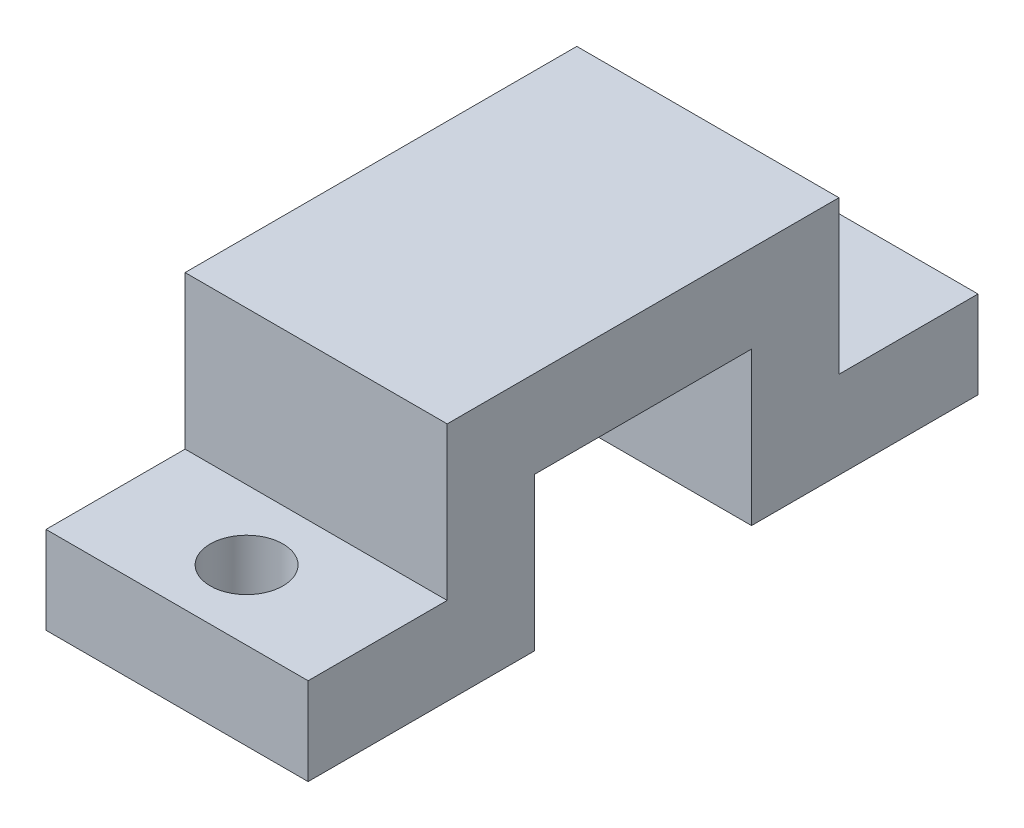
ISO-10303-21;
HEADER;
FILE_DESCRIPTION(('STEP AP214'),'2;1');
FILE_NAME('part.step','',(''),(''),'','','');
FILE_SCHEMA(('AUTOMOTIVE_DESIGN { 1 0 10303 214 1 1 1 1 }'));
ENDSEC;
DATA;
#1=APPLICATION_CONTEXT('core data for automotive mechanical design processes');
#2=APPLICATION_PROTOCOL_DEFINITION('international standard','automotive_design',2000,#1);
#3=PRODUCT_CONTEXT('',#1,'mechanical');
#4=PRODUCT('Part','Part','',(#3));
#5=PRODUCT_RELATED_PRODUCT_CATEGORY('part','',(#4));
#6=PRODUCT_DEFINITION_FORMATION('','',#4);
#7=PRODUCT_DEFINITION_CONTEXT('part definition',#1,'design');
#8=PRODUCT_DEFINITION('design','',#6,#7);
#9=PRODUCT_DEFINITION_SHAPE('','',#8);
#10=(LENGTH_UNIT() NAMED_UNIT(*) SI_UNIT(.MILLI.,.METRE.));
#11=(NAMED_UNIT(*) PLANE_ANGLE_UNIT() SI_UNIT($,.RADIAN.));
#12=(NAMED_UNIT(*) SI_UNIT($,.STERADIAN.) SOLID_ANGLE_UNIT());
#13=UNCERTAINTY_MEASURE_WITH_UNIT(LENGTH_MEASURE(1.E-05),#10,'distance_accuracy_value','');
#14=(GEOMETRIC_REPRESENTATION_CONTEXT(3) GLOBAL_UNCERTAINTY_ASSIGNED_CONTEXT((#13)) GLOBAL_UNIT_ASSIGNED_CONTEXT((#10,
#11,#12)) REPRESENTATION_CONTEXT('',''));
#15=CARTESIAN_POINT('',(0.,0.,0.));
#16=DIRECTION('',(0.,0.,1.));
#17=DIRECTION('',(1.,0.,0.));
#18=AXIS2_PLACEMENT_3D('',#15,#16,#17);
#19=CARTESIAN_POINT('',(0.,0.,0.));
#20=DIRECTION('',(0.,-1.,0.));
#21=DIRECTION('',(0.,0.,-1.));
#22=AXIS2_PLACEMENT_3D('',#19,#20,#21);
#23=PLANE('',#22);
#24=CARTESIAN_POINT('',(4.5,0.,-20.8336828319911));
#25=DIRECTION('',(0.,-1.,0.));
#26=DIRECTION('',(0.,0.,-1.));
#27=AXIS2_PLACEMENT_3D('',#24,#25,#26);
#28=CIRCLE('',#27,1.24999999999999);
#29=CARTESIAN_POINT('',(4.5,0.,-22.0836828319911));
#30=VERTEX_POINT('',#29);
#31=EDGE_CURVE('E266',#30,#30,#28,.T.);
#32=ORIENTED_EDGE('',*,*,#31,.F.);
#33=EDGE_LOOP('',(#32));
#34=FACE_BOUND('',#33,.T.);
#35=DIRECTION('',(0.,0.,-1.));
#36=VECTOR('',#35,1.);
#37=CARTESIAN_POINT('',(9.,0.,-0.2211828319911));
#38=LINE('',#37,#36);
#39=CARTESIAN_POINT('',(9.,0.,-15.4461828319911));
#40=VERTEX_POINT('',#39);
#41=CARTESIAN_POINT('',(9.,0.,-23.2211828319911));
#42=VERTEX_POINT('',#41);
#43=EDGE_CURVE('E234',#40,#42,#38,.T.);
#44=ORIENTED_EDGE('',*,*,#43,.F.);
#45=DIRECTION('',(-1.,0.,0.));
#46=VECTOR('',#45,1.);
#47=CARTESIAN_POINT('',(0.,0.,-15.4461828319911));
#48=LINE('',#47,#46);
#49=CARTESIAN_POINT('',(0.,0.,-15.4461828319911));
#50=VERTEX_POINT('',#49);
#51=EDGE_CURVE('E77',#40,#50,#48,.T.);
#52=ORIENTED_EDGE('',*,*,#51,.T.);
#53=DIRECTION('',(0.,0.,1.));
#54=VECTOR('',#53,1.);
#55=CARTESIAN_POINT('',(0.,0.,-0.2211828319911));
#56=LINE('',#55,#54);
#57=CARTESIAN_POINT('',(0.,0.,-23.2211828319911));
#58=VERTEX_POINT('',#57);
#59=EDGE_CURVE('E228',#58,#50,#56,.T.);
#60=ORIENTED_EDGE('',*,*,#59,.F.);
#61=DIRECTION('',(-1.,0.,0.));
#62=VECTOR('',#61,1.);
#63=CARTESIAN_POINT('',(0.,0.,-23.2211828319911));
#64=LINE('',#63,#62);
#65=EDGE_CURVE('E236',#42,#58,#64,.T.);
#66=ORIENTED_EDGE('',*,*,#65,.F.);
#67=EDGE_LOOP('',(#44,#52,#60,#66));
#68=FACE_BOUND('',#67,.T.);
#69=ADVANCED_FACE('F69',(#34,#68),#23,.T.);
#70=CARTESIAN_POINT('',(0.,15.,-0.2211828319911));
#71=DIRECTION('',(1.,0.,0.));
#72=DIRECTION('',(0.,0.,-1.));
#73=AXIS2_PLACEMENT_3D('',#70,#71,#72);
#74=PLANE('',#73);
#75=DIRECTION('',(0.,0.,-1.));
#76=VECTOR('',#75,1.);
#77=CARTESIAN_POINT('',(0.,5.25,-0.2211828319911));
#78=LINE('',#77,#76);
#79=CARTESIAN_POINT('',(0.,5.25,-7.99618283199105));
#80=VERTEX_POINT('',#79);
#81=CARTESIAN_POINT('',(0.,5.25,-15.4461828319911));
#82=VERTEX_POINT('',#81);
#83=EDGE_CURVE('E187',#80,#82,#78,.T.);
#84=ORIENTED_EDGE('',*,*,#83,.F.);
#85=DIRECTION('',(0.,-1.,0.));
#86=VECTOR('',#85,1.);
#87=CARTESIAN_POINT('',(0.,15.,-7.99618283199105));
#88=LINE('',#87,#86);
#89=CARTESIAN_POINT('',(0.,0.,-7.99618283199105));
#90=VERTEX_POINT('',#89);
#91=EDGE_CURVE('E164',#80,#90,#88,.T.);
#92=ORIENTED_EDGE('',*,*,#91,.T.);
#93=CARTESIAN_POINT('',(0.,0.,-0.2211828319911));
#94=VERTEX_POINT('',#93);
#95=EDGE_CURVE('E227',#90,#94,#56,.T.);
#96=ORIENTED_EDGE('',*,*,#95,.T.);
#97=DIRECTION('',(0.,-1.,0.));
#98=VECTOR('',#97,1.);
#99=CARTESIAN_POINT('',(0.,15.,-0.2211828319911));
#100=LINE('',#99,#98);
#101=CARTESIAN_POINT('',(0.,3.,-0.2211828319911));
#102=VERTEX_POINT('',#101);
#103=EDGE_CURVE('E246',#102,#94,#100,.T.);
#104=ORIENTED_EDGE('',*,*,#103,.F.);
#105=DIRECTION('',(0.,0.,-1.));
#106=VECTOR('',#105,1.);
#107=CARTESIAN_POINT('',(0.,3.,-0.2211828319911));
#108=LINE('',#107,#106);
#109=CARTESIAN_POINT('',(0.,3.,-4.99618283199106));
#110=VERTEX_POINT('',#109);
#111=EDGE_CURVE('E216',#102,#110,#108,.T.);
#112=ORIENTED_EDGE('',*,*,#111,.T.);
#113=DIRECTION('',(0.,1.,0.));
#114=VECTOR('',#113,1.);
#115=CARTESIAN_POINT('',(0.,15.,-4.99618283199106));
#116=LINE('',#115,#114);
#117=CARTESIAN_POINT('',(0.,8.25,-4.99618283199106));
#118=VERTEX_POINT('',#117);
#119=EDGE_CURVE('E219',#110,#118,#116,.T.);
#120=ORIENTED_EDGE('',*,*,#119,.T.);
#121=DIRECTION('',(0.,0.,-1.));
#122=VECTOR('',#121,1.);
#123=CARTESIAN_POINT('',(0.,8.25,-0.2211828319911));
#124=LINE('',#123,#122);
#125=CARTESIAN_POINT('',(0.,8.25,-18.4461828319911));
#126=VERTEX_POINT('',#125);
#127=EDGE_CURVE('E222',#118,#126,#124,.T.);
#128=ORIENTED_EDGE('',*,*,#127,.T.);
#129=DIRECTION('',(0.,1.,0.));
#130=VECTOR('',#129,1.);
#131=CARTESIAN_POINT('',(0.,15.,-18.4461828319911));
#132=LINE('',#131,#130);
#133=CARTESIAN_POINT('',(0.,3.,-18.4461828319911));
#134=VERTEX_POINT('',#133);
#135=EDGE_CURVE('E225',#134,#126,#132,.T.);
#136=ORIENTED_EDGE('',*,*,#135,.F.);
#137=DIRECTION('',(0.,0.,-1.));
#138=VECTOR('',#137,1.);
#139=CARTESIAN_POINT('',(0.,3.,-0.2211828319911));
#140=LINE('',#139,#138);
#141=CARTESIAN_POINT('',(0.,3.,-23.2211828319911));
#142=VERTEX_POINT('',#141);
#143=EDGE_CURVE('E203',#134,#142,#140,.T.);
#144=ORIENTED_EDGE('',*,*,#143,.T.);
#145=DIRECTION('',(0.,-1.,0.));
#146=VECTOR('',#145,1.);
#147=CARTESIAN_POINT('',(0.,15.,-23.2211828319911));
#148=LINE('',#147,#146);
#149=EDGE_CURVE('E239',#142,#58,#148,.T.);
#150=ORIENTED_EDGE('',*,*,#149,.T.);
#151=ORIENTED_EDGE('',*,*,#59,.T.);
#152=DIRECTION('',(0.,-1.,0.));
#153=VECTOR('',#152,1.);
#154=CARTESIAN_POINT('',(0.,15.,-15.4461828319911));
#155=LINE('',#154,#153);
#156=EDGE_CURVE('E84',#82,#50,#155,.T.);
#157=ORIENTED_EDGE('',*,*,#156,.F.);
#158=EDGE_LOOP('',(#84,#92,#96,#104,#112,#120,#128,#136,#144,#150,#151,#157));
#159=FACE_BOUND('',#158,.T.);
#160=ADVANCED_FACE('F71',(#159),#74,.F.);
#161=CARTESIAN_POINT('',(0.,15.,-0.2211828319911));
#162=DIRECTION('',(0.,0.,-1.));
#163=DIRECTION('',(-1.,0.,0.));
#164=AXIS2_PLACEMENT_3D('',#161,#162,#163);
#165=PLANE('',#164);
#166=DIRECTION('',(0.,-1.,0.));
#167=VECTOR('',#166,1.);
#168=CARTESIAN_POINT('',(9.,15.,-0.2211828319911));
#169=LINE('',#168,#167);
#170=CARTESIAN_POINT('',(9.,3.,-0.2211828319911));
#171=VERTEX_POINT('',#170);
#172=CARTESIAN_POINT('',(9.,0.,-0.2211828319911));
#173=VERTEX_POINT('',#172);
#174=EDGE_CURVE('E244',#171,#173,#169,.T.);
#175=ORIENTED_EDGE('',*,*,#174,.F.);
#176=DIRECTION('',(1.,0.,0.));
#177=VECTOR('',#176,1.);
#178=CARTESIAN_POINT('',(-6.,3.,-0.2211828319911));
#179=LINE('',#178,#177);
#180=EDGE_CURVE('E212',#102,#171,#179,.T.);
#181=ORIENTED_EDGE('',*,*,#180,.F.);
#182=ORIENTED_EDGE('',*,*,#103,.T.);
#183=DIRECTION('',(1.,0.,0.));
#184=VECTOR('',#183,1.);
#185=CARTESIAN_POINT('',(0.,0.,-0.2211828319911));
#186=LINE('',#185,#184);
#187=EDGE_CURVE('E231',#94,#173,#186,.T.);
#188=ORIENTED_EDGE('',*,*,#187,.T.);
#189=EDGE_LOOP('',(#175,#181,#182,#188));
#190=FACE_BOUND('',#189,.T.);
#191=ADVANCED_FACE('F297',(#190),#165,.F.);
#192=CARTESIAN_POINT('',(9.,15.,-0.2211828319911));
#193=DIRECTION('',(-1.,0.,0.));
#194=DIRECTION('',(0.,0.,1.));
#195=AXIS2_PLACEMENT_3D('',#192,#193,#194);
#196=PLANE('',#195);
#197=CARTESIAN_POINT('',(9.,0.,-7.99618283199105));
#198=VERTEX_POINT('',#197);
#199=EDGE_CURVE('E181',#173,#198,#38,.T.);
#200=ORIENTED_EDGE('',*,*,#199,.T.);
#201=DIRECTION('',(0.,-1.,0.));
#202=VECTOR('',#201,1.);
#203=CARTESIAN_POINT('',(9.,5.25,-7.99618283199105));
#204=LINE('',#203,#202);
#205=CARTESIAN_POINT('',(9.,5.25,-7.99618283199105));
#206=VERTEX_POINT('',#205);
#207=EDGE_CURVE('E161',#206,#198,#204,.T.);
#208=ORIENTED_EDGE('',*,*,#207,.F.);
#209=DIRECTION('',(0.,0.,-1.));
#210=VECTOR('',#209,1.);
#211=CARTESIAN_POINT('',(9.,5.25,-7.99618283199105));
#212=LINE('',#211,#210);
#213=CARTESIAN_POINT('',(9.,5.25,-15.4461828319911));
#214=VERTEX_POINT('',#213);
#215=EDGE_CURVE('E171',#206,#214,#212,.T.);
#216=ORIENTED_EDGE('',*,*,#215,.T.);
#217=DIRECTION('',(0.,-1.,0.));
#218=VECTOR('',#217,1.);
#219=CARTESIAN_POINT('',(9.,5.25,-15.4461828319911));
#220=LINE('',#219,#218);
#221=EDGE_CURVE('E176',#214,#40,#220,.T.);
#222=ORIENTED_EDGE('',*,*,#221,.T.);
#223=ORIENTED_EDGE('',*,*,#43,.T.);
#224=DIRECTION('',(0.,-1.,0.));
#225=VECTOR('',#224,1.);
#226=CARTESIAN_POINT('',(9.,15.,-23.2211828319911));
#227=LINE('',#226,#225);
#228=CARTESIAN_POINT('',(9.,3.,-23.2211828319911));
#229=VERTEX_POINT('',#228);
#230=EDGE_CURVE('E241',#229,#42,#227,.T.);
#231=ORIENTED_EDGE('',*,*,#230,.F.);
#232=DIRECTION('',(0.,0.,-1.));
#233=VECTOR('',#232,1.);
#234=CARTESIAN_POINT('',(9.,3.,0.));
#235=LINE('',#234,#233);
#236=CARTESIAN_POINT('',(9.,3.,-18.4461828319911));
#237=VERTEX_POINT('',#236);
#238=EDGE_CURVE('E92',#237,#229,#235,.T.);
#239=ORIENTED_EDGE('',*,*,#238,.F.);
#240=DIRECTION('',(0.,1.,0.));
#241=VECTOR('',#240,1.);
#242=CARTESIAN_POINT('',(9.,0.,-18.4461828319911));
#243=LINE('',#242,#241);
#244=CARTESIAN_POINT('',(9.,8.25,-18.4461828319911));
#245=VERTEX_POINT('',#244);
#246=EDGE_CURVE('E198',#237,#245,#243,.T.);
#247=ORIENTED_EDGE('',*,*,#246,.T.);
#248=DIRECTION('',(0.,0.,-1.));
#249=VECTOR('',#248,1.);
#250=CARTESIAN_POINT('',(9.,8.25,0.));
#251=LINE('',#250,#249);
#252=CARTESIAN_POINT('',(9.,8.25,-4.99618283199106));
#253=VERTEX_POINT('',#252);
#254=EDGE_CURVE('E195',#253,#245,#251,.T.);
#255=ORIENTED_EDGE('',*,*,#254,.F.);
#256=DIRECTION('',(0.,1.,0.));
#257=VECTOR('',#256,1.);
#258=CARTESIAN_POINT('',(9.,0.,-4.99618283199106));
#259=LINE('',#258,#257);
#260=CARTESIAN_POINT('',(9.,3.,-4.99618283199106));
#261=VERTEX_POINT('',#260);
#262=EDGE_CURVE('E192',#261,#253,#259,.T.);
#263=ORIENTED_EDGE('',*,*,#262,.F.);
#264=EDGE_CURVE('E189',#171,#261,#235,.T.);
#265=ORIENTED_EDGE('',*,*,#264,.F.);
#266=ORIENTED_EDGE('',*,*,#174,.T.);
#267=EDGE_LOOP('',(#200,#208,#216,#222,#223,#231,#239,#247,#255,#263,#265,#266));
#268=FACE_BOUND('',#267,.T.);
#269=ADVANCED_FACE('F179',(#268),#196,.F.);
#270=CARTESIAN_POINT('',(0.,15.,-23.2211828319911));
#271=DIRECTION('',(0.,0.,1.));
#272=DIRECTION('',(1.,0.,0.));
#273=AXIS2_PLACEMENT_3D('',#270,#271,#272);
#274=PLANE('',#273);
#275=ORIENTED_EDGE('',*,*,#149,.F.);
#276=DIRECTION('',(1.,0.,0.));
#277=VECTOR('',#276,1.);
#278=CARTESIAN_POINT('',(-6.,3.,-23.2211828319911));
#279=LINE('',#278,#277);
#280=EDGE_CURVE('E201',#142,#229,#279,.T.);
#281=ORIENTED_EDGE('',*,*,#280,.T.);
#282=ORIENTED_EDGE('',*,*,#230,.T.);
#283=ORIENTED_EDGE('',*,*,#65,.T.);
#284=EDGE_LOOP('',(#275,#281,#282,#283));
#285=FACE_BOUND('',#284,.T.);
#286=ADVANCED_FACE('F256',(#285),#274,.F.);
#287=CARTESIAN_POINT('',(4.5,0.,-2.60868283199106));
#288=DIRECTION('',(0.,-1.,0.));
#289=DIRECTION('',(0.,0.,-1.));
#290=AXIS2_PLACEMENT_3D('',#287,#288,#289);
#291=CIRCLE('',#290,1.24999999999999);
#292=CARTESIAN_POINT('',(4.5,0.,-3.85868283199105));
#293=VERTEX_POINT('',#292);
#294=EDGE_CURVE('E168',#293,#293,#291,.T.);
#295=ORIENTED_EDGE('',*,*,#294,.F.);
#296=EDGE_LOOP('',(#295));
#297=FACE_BOUND('',#296,.T.);
#298=DIRECTION('',(-1.,0.,0.));
#299=VECTOR('',#298,1.);
#300=CARTESIAN_POINT('',(0.,0.,-7.99618283199105));
#301=LINE('',#300,#299);
#302=EDGE_CURVE('E12',#198,#90,#301,.T.);
#303=ORIENTED_EDGE('',*,*,#302,.F.);
#304=ORIENTED_EDGE('',*,*,#199,.F.);
#305=ORIENTED_EDGE('',*,*,#187,.F.);
#306=ORIENTED_EDGE('',*,*,#95,.F.);
#307=EDGE_LOOP('',(#303,#304,#305,#306));
#308=FACE_BOUND('',#307,.T.);
#309=ADVANCED_FACE('F302',(#297,#308),#23,.T.);
#310=CARTESIAN_POINT('',(-6.,0.,-18.4461828319911));
#311=DIRECTION('',(0.,0.,-1.));
#312=DIRECTION('',(-1.,0.,0.));
#313=AXIS2_PLACEMENT_3D('',#310,#311,#312);
#314=PLANE('',#313);
#315=ORIENTED_EDGE('',*,*,#135,.T.);
#316=DIRECTION('',(1.,0.,0.));
#317=VECTOR('',#316,1.);
#318=CARTESIAN_POINT('',(-6.,8.25,-18.4461828319911));
#319=LINE('',#318,#317);
#320=EDGE_CURVE('E206',#126,#245,#319,.T.);
#321=ORIENTED_EDGE('',*,*,#320,.T.);
#322=ORIENTED_EDGE('',*,*,#246,.F.);
#323=DIRECTION('',(1.,0.,0.));
#324=VECTOR('',#323,1.);
#325=CARTESIAN_POINT('',(-6.,3.,-18.4461828319911));
#326=LINE('',#325,#324);
#327=EDGE_CURVE('E204',#134,#237,#326,.T.);
#328=ORIENTED_EDGE('',*,*,#327,.F.);
#329=EDGE_LOOP('',(#315,#321,#322,#328));
#330=FACE_BOUND('',#329,.T.);
#331=ADVANCED_FACE('F282',(#330),#314,.T.);
#332=CARTESIAN_POINT('',(-6.,8.25,0.));
#333=DIRECTION('',(0.,-1.,0.));
#334=DIRECTION('',(0.,0.,-1.));
#335=AXIS2_PLACEMENT_3D('',#332,#333,#334);
#336=PLANE('',#335);
#337=DIRECTION('',(1.,0.,0.));
#338=VECTOR('',#337,1.);
#339=CARTESIAN_POINT('',(-6.,8.25,-4.99618283199106));
#340=LINE('',#339,#338);
#341=EDGE_CURVE('E208',#118,#253,#340,.T.);
#342=ORIENTED_EDGE('',*,*,#341,.T.);
#343=ORIENTED_EDGE('',*,*,#254,.T.);
#344=ORIENTED_EDGE('',*,*,#320,.F.);
#345=ORIENTED_EDGE('',*,*,#127,.F.);
#346=EDGE_LOOP('',(#342,#343,#344,#345));
#347=FACE_BOUND('',#346,.T.);
#348=ADVANCED_FACE('F288',(#347),#336,.F.);
#349=CARTESIAN_POINT('',(-6.,0.,-4.99618283199106));
#350=DIRECTION('',(0.,0.,-1.));
#351=DIRECTION('',(-1.,0.,0.));
#352=AXIS2_PLACEMENT_3D('',#349,#350,#351);
#353=PLANE('',#352);
#354=DIRECTION('',(1.,0.,0.));
#355=VECTOR('',#354,1.);
#356=CARTESIAN_POINT('',(-6.,3.,-4.99618283199106));
#357=LINE('',#356,#355);
#358=EDGE_CURVE('E210',#110,#261,#357,.T.);
#359=ORIENTED_EDGE('',*,*,#358,.T.);
#360=ORIENTED_EDGE('',*,*,#262,.T.);
#361=ORIENTED_EDGE('',*,*,#341,.F.);
#362=ORIENTED_EDGE('',*,*,#119,.F.);
#363=EDGE_LOOP('',(#359,#360,#361,#362));
#364=FACE_BOUND('',#363,.T.);
#365=ADVANCED_FACE('F291',(#364),#353,.F.);
#366=CARTESIAN_POINT('',(-6.,3.,0.));
#367=DIRECTION('',(0.,-1.,0.));
#368=DIRECTION('',(0.,0.,-1.));
#369=AXIS2_PLACEMENT_3D('',#366,#367,#368);
#370=PLANE('',#369);
#371=CARTESIAN_POINT('',(4.5,3.,-2.60868283199106));
#372=DIRECTION('',(0.,1.,0.));
#373=DIRECTION('',(0.,0.,1.));
#374=AXIS2_PLACEMENT_3D('',#371,#372,#373);
#375=CIRCLE('',#374,1.24999999999999);
#376=CARTESIAN_POINT('',(4.5,3.,-1.35868283199107));
#377=VERTEX_POINT('',#376);
#378=EDGE_CURVE('E263',#377,#377,#375,.T.);
#379=ORIENTED_EDGE('',*,*,#378,.F.);
#380=EDGE_LOOP('',(#379));
#381=FACE_BOUND('',#380,.T.);
#382=ORIENTED_EDGE('',*,*,#180,.T.);
#383=ORIENTED_EDGE('',*,*,#264,.T.);
#384=ORIENTED_EDGE('',*,*,#358,.F.);
#385=ORIENTED_EDGE('',*,*,#111,.F.);
#386=EDGE_LOOP('',(#382,#383,#384,#385));
#387=FACE_BOUND('',#386,.T.);
#388=ADVANCED_FACE('F277',(#381,#387),#370,.F.);
#389=CARTESIAN_POINT('',(4.5,3.00000000000002,-20.8336828319911));
#390=DIRECTION('',(0.,1.,0.));
#391=DIRECTION('',(0.,0.,1.));
#392=AXIS2_PLACEMENT_3D('',#389,#390,#391);
#393=CIRCLE('',#392,1.24999999999999);
#394=CARTESIAN_POINT('',(4.5,3.00000000000002,-19.5836828319911));
#395=VERTEX_POINT('',#394);
#396=EDGE_CURVE('E269',#395,#395,#393,.T.);
#397=ORIENTED_EDGE('',*,*,#396,.F.);
#398=EDGE_LOOP('',(#397));
#399=FACE_BOUND('',#398,.T.);
#400=ORIENTED_EDGE('',*,*,#327,.T.);
#401=ORIENTED_EDGE('',*,*,#238,.T.);
#402=ORIENTED_EDGE('',*,*,#280,.F.);
#403=ORIENTED_EDGE('',*,*,#143,.F.);
#404=EDGE_LOOP('',(#400,#401,#402,#403));
#405=FACE_BOUND('',#404,.T.);
#406=ADVANCED_FACE('F275',(#399,#405),#370,.F.);
#407=CARTESIAN_POINT('',(-6.,5.25,-7.99618283199105));
#408=DIRECTION('',(0.,-1.,0.));
#409=DIRECTION('',(0.,0.,-1.));
#410=AXIS2_PLACEMENT_3D('',#407,#408,#409);
#411=PLANE('',#410);
#412=ORIENTED_EDGE('',*,*,#83,.T.);
#413=DIRECTION('',(1.,0.,0.));
#414=VECTOR('',#413,1.);
#415=CARTESIAN_POINT('',(-6.,5.25,-15.4461828319911));
#416=LINE('',#415,#414);
#417=EDGE_CURVE('E167',#82,#214,#416,.T.);
#418=ORIENTED_EDGE('',*,*,#417,.T.);
#419=ORIENTED_EDGE('',*,*,#215,.F.);
#420=DIRECTION('',(1.,0.,0.));
#421=VECTOR('',#420,1.);
#422=CARTESIAN_POINT('',(-6.,5.25,-7.99618283199105));
#423=LINE('',#422,#421);
#424=EDGE_CURVE('E157',#80,#206,#423,.T.);
#425=ORIENTED_EDGE('',*,*,#424,.F.);
#426=EDGE_LOOP('',(#412,#418,#419,#425));
#427=FACE_BOUND('',#426,.T.);
#428=ADVANCED_FACE('F172',(#427),#411,.T.);
#429=CARTESIAN_POINT('',(-6.,5.25,-7.99618283199105));
#430=DIRECTION('',(0.,0.,1.));
#431=DIRECTION('',(1.,0.,0.));
#432=AXIS2_PLACEMENT_3D('',#429,#430,#431);
#433=PLANE('',#432);
#434=ORIENTED_EDGE('',*,*,#424,.T.);
#435=ORIENTED_EDGE('',*,*,#207,.T.);
#436=ORIENTED_EDGE('',*,*,#302,.T.);
#437=ORIENTED_EDGE('',*,*,#91,.F.);
#438=EDGE_LOOP('',(#434,#435,#436,#437));
#439=FACE_BOUND('',#438,.T.);
#440=ADVANCED_FACE('F159',(#439),#433,.F.);
#441=CARTESIAN_POINT('',(-6.,5.25,-15.4461828319911));
#442=DIRECTION('',(0.,0.,1.));
#443=DIRECTION('',(0.,-1.,0.));
#444=AXIS2_PLACEMENT_3D('',#441,#442,#443);
#445=PLANE('',#444);
#446=ORIENTED_EDGE('',*,*,#156,.T.);
#447=ORIENTED_EDGE('',*,*,#51,.F.);
#448=ORIENTED_EDGE('',*,*,#221,.F.);
#449=ORIENTED_EDGE('',*,*,#417,.F.);
#450=EDGE_LOOP('',(#446,#447,#448,#449));
#451=FACE_BOUND('',#450,.T.);
#452=ADVANCED_FACE('F258',(#451),#445,.T.);
#453=CARTESIAN_POINT('',(4.5,3.,-2.60868283199106));
#454=DIRECTION('',(0.,1.,0.));
#455=DIRECTION('',(0.,0.,1.));
#456=AXIS2_PLACEMENT_3D('',#453,#454,#455);
#457=CYLINDRICAL_SURFACE('',#456,1.24999999999999);
#458=ORIENTED_EDGE('',*,*,#294,.T.);
#459=EDGE_LOOP('',(#458));
#460=FACE_BOUND('',#459,.T.);
#461=ORIENTED_EDGE('',*,*,#378,.T.);
#462=EDGE_LOOP('',(#461));
#463=FACE_BOUND('',#462,.T.);
#464=ADVANCED_FACE('F324',(#460,#463),#457,.F.);
#465=CARTESIAN_POINT('',(4.5,3.00000000000002,-20.8336828319911));
#466=DIRECTION('',(0.,1.,0.));
#467=DIRECTION('',(0.,0.,1.));
#468=AXIS2_PLACEMENT_3D('',#465,#466,#467);
#469=CYLINDRICAL_SURFACE('',#468,1.24999999999999);
#470=ORIENTED_EDGE('',*,*,#31,.T.);
#471=EDGE_LOOP('',(#470));
#472=FACE_BOUND('',#471,.T.);
#473=ORIENTED_EDGE('',*,*,#396,.T.);
#474=EDGE_LOOP('',(#473));
#475=FACE_BOUND('',#474,.T.);
#476=ADVANCED_FACE('F273',(#472,#475),#469,.F.);
#477=CLOSED_SHELL('',(#69,#160,#191,#269,#286,#309,#331,#348,#365,#388,#406,#428,#440,#452,#464,#476));
#478=MANIFOLD_SOLID_BREP('B2',#477);
#479=ADVANCED_BREP_SHAPE_REPRESENTATION('',(#18,#478),#14);
#480=SHAPE_DEFINITION_REPRESENTATION(#9,#479);
ENDSEC;
END-ISO-10303-21;
